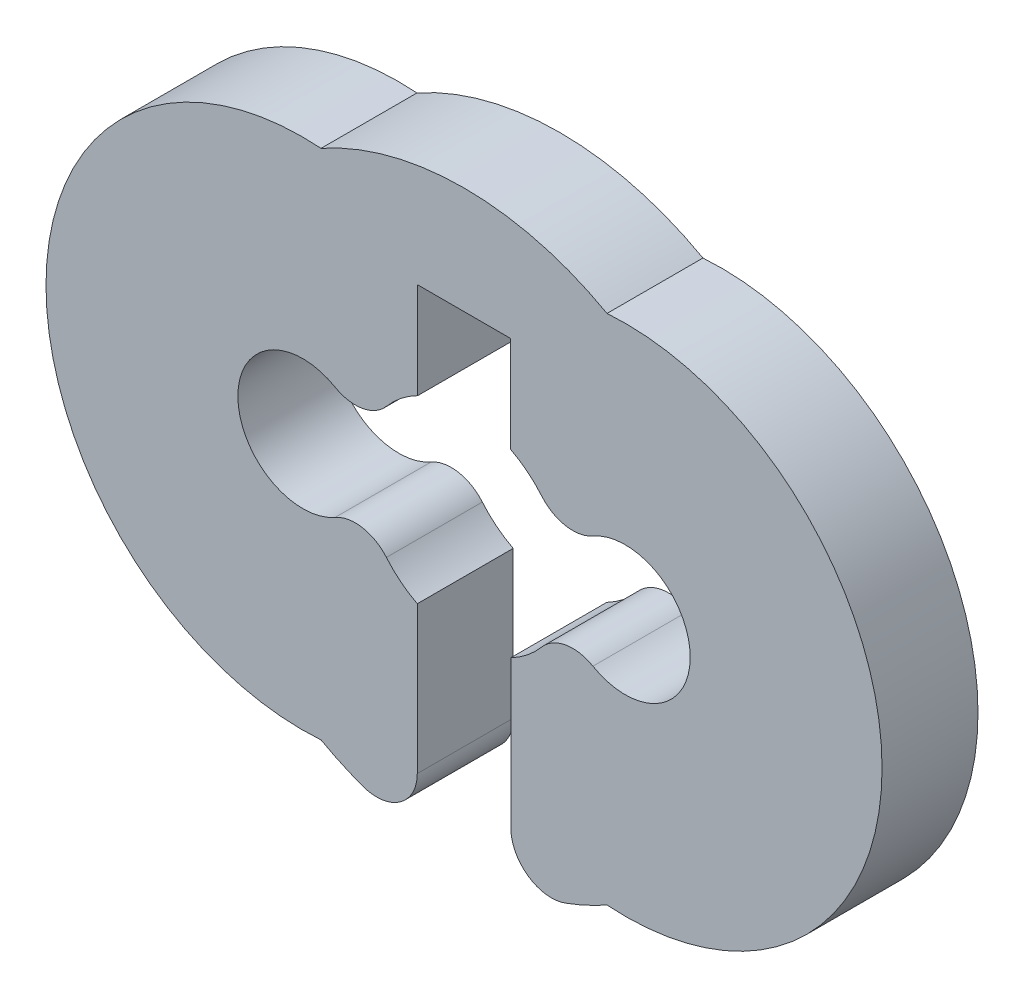
ISO-10303-21;
HEADER;
FILE_DESCRIPTION(('STEP AP214'),'2;1');
FILE_NAME('part.step','',(''),(''),'','','');
FILE_SCHEMA(('AUTOMOTIVE_DESIGN { 1 0 10303 214 1 1 1 1 }'));
ENDSEC;
DATA;
#1=APPLICATION_CONTEXT('core data for automotive mechanical design processes');
#2=APPLICATION_PROTOCOL_DEFINITION('international standard','automotive_design',2000,#1);
#3=PRODUCT_CONTEXT('',#1,'mechanical');
#4=PRODUCT('Part','Part','',(#3));
#5=PRODUCT_RELATED_PRODUCT_CATEGORY('part','',(#4));
#6=PRODUCT_DEFINITION_FORMATION('','',#4);
#7=PRODUCT_DEFINITION_CONTEXT('part definition',#1,'design');
#8=PRODUCT_DEFINITION('design','',#6,#7);
#9=PRODUCT_DEFINITION_SHAPE('','',#8);
#10=(LENGTH_UNIT() NAMED_UNIT(*) SI_UNIT(.MILLI.,.METRE.));
#11=(NAMED_UNIT(*) PLANE_ANGLE_UNIT() SI_UNIT($,.RADIAN.));
#12=(NAMED_UNIT(*) SI_UNIT($,.STERADIAN.) SOLID_ANGLE_UNIT());
#13=UNCERTAINTY_MEASURE_WITH_UNIT(LENGTH_MEASURE(1.E-05),#10,'distance_accuracy_value','');
#14=(GEOMETRIC_REPRESENTATION_CONTEXT(3) GLOBAL_UNCERTAINTY_ASSIGNED_CONTEXT((#13)) GLOBAL_UNIT_ASSIGNED_CONTEXT((#10,
#11,#12)) REPRESENTATION_CONTEXT('',''));
#15=CARTESIAN_POINT('',(0.,0.,0.));
#16=DIRECTION('',(0.,0.,1.));
#17=DIRECTION('',(1.,0.,0.));
#18=AXIS2_PLACEMENT_3D('',#15,#16,#17);
#19=CARTESIAN_POINT('',(0.,0.,3.));
#20=DIRECTION('',(0.,0.,-1.));
#21=DIRECTION('',(-1.,0.,0.));
#22=AXIS2_PLACEMENT_3D('',#19,#20,#21);
#23=CYLINDRICAL_SURFACE('',#22,3.17499999999999);
#24=CARTESIAN_POINT('',(0.,0.,0.));
#25=DIRECTION('',(0.,0.,-1.));
#26=DIRECTION('',(1.,0.,0.));
#27=AXIS2_PLACEMENT_3D('',#24,#25,#26);
#28=CIRCLE('',#27,3.17499999999999);
#29=CARTESIAN_POINT('',(1.4475,2.82583947704041,0.));
#30=VERTEX_POINT('',#29);
#31=CARTESIAN_POINT('',(2.42771989137687,2.04616742448243,0.));
#32=VERTEX_POINT('',#31);
#33=EDGE_CURVE('E264',#30,#32,#28,.T.);
#34=ORIENTED_EDGE('',*,*,#33,.T.);
#35=DIRECTION('',(0.,0.,-1.));
#36=VECTOR('',#35,1.);
#37=CARTESIAN_POINT('',(2.42771989137687,2.04616742448243,3.));
#38=LINE('',#37,#36);
#39=CARTESIAN_POINT('',(2.42771989137687,2.04616742448243,3.));
#40=VERTEX_POINT('',#39);
#41=EDGE_CURVE('E49',#32,#40,#38,.F.);
#42=ORIENTED_EDGE('',*,*,#41,.T.);
#43=CARTESIAN_POINT('',(0.,0.,3.));
#44=DIRECTION('',(0.,0.,-1.));
#45=DIRECTION('',(1.,0.,0.));
#46=AXIS2_PLACEMENT_3D('',#43,#44,#45);
#47=CIRCLE('',#46,3.17499999999999);
#48=CARTESIAN_POINT('',(1.4475,2.82583947704041,3.));
#49=VERTEX_POINT('',#48);
#50=EDGE_CURVE('E263',#49,#40,#47,.T.);
#51=ORIENTED_EDGE('',*,*,#50,.F.);
#52=DIRECTION('',(0.,0.,-1.));
#53=VECTOR('',#52,1.);
#54=CARTESIAN_POINT('',(1.4475,2.82583947704041,3.));
#55=LINE('',#54,#53);
#56=EDGE_CURVE('E334',#49,#30,#55,.T.);
#57=ORIENTED_EDGE('',*,*,#56,.T.);
#58=EDGE_LOOP('',(#34,#42,#51,#57));
#59=FACE_BOUND('',#58,.T.);
#60=ADVANCED_FACE('F45',(#59),#23,.F.);
#61=CARTESIAN_POINT('',(5.04108486083811,0.,3.));
#62=DIRECTION('',(0.,0.,-1.));
#63=DIRECTION('',(-1.,0.,0.));
#64=AXIS2_PLACEMENT_3D('',#61,#62,#63);
#65=CYLINDRICAL_SURFACE('',#64,2.032);
#66=CARTESIAN_POINT('',(5.04108486083811,0.,0.));
#67=DIRECTION('',(0.,0.,-1.));
#68=DIRECTION('',(-1.,0.,0.));
#69=AXIS2_PLACEMENT_3D('',#66,#67,#68);
#70=CIRCLE('',#69,2.032);
#71=CARTESIAN_POINT('',(4.03045285289318,1.76285193493872,0.));
#72=VERTEX_POINT('',#71);
#73=CARTESIAN_POINT('',(4.03045285289318,-1.76285193493872,0.));
#74=VERTEX_POINT('',#73);
#75=EDGE_CURVE('E305',#72,#74,#70,.T.);
#76=ORIENTED_EDGE('',*,*,#75,.T.);
#77=DIRECTION('',(0.,0.,-1.));
#78=VECTOR('',#77,1.);
#79=CARTESIAN_POINT('',(4.03045285289318,-1.76285193493872,3.));
#80=LINE('',#79,#78);
#81=CARTESIAN_POINT('',(4.03045285289318,-1.76285193493872,3.));
#82=VERTEX_POINT('',#81);
#83=EDGE_CURVE('E258',#74,#82,#80,.F.);
#84=ORIENTED_EDGE('',*,*,#83,.T.);
#85=CARTESIAN_POINT('',(5.04108486083811,0.,3.));
#86=DIRECTION('',(0.,0.,-1.));
#87=DIRECTION('',(-1.,0.,0.));
#88=AXIS2_PLACEMENT_3D('',#85,#86,#87);
#89=CIRCLE('',#88,2.032);
#90=CARTESIAN_POINT('',(4.03045285289318,1.76285193493872,3.));
#91=VERTEX_POINT('',#90);
#92=EDGE_CURVE('E204',#91,#82,#89,.T.);
#93=ORIENTED_EDGE('',*,*,#92,.F.);
#94=DIRECTION('',(0.,0.,-1.));
#95=VECTOR('',#94,1.);
#96=CARTESIAN_POINT('',(4.03045285289318,1.76285193493872,3.));
#97=LINE('',#96,#95);
#98=EDGE_CURVE('E251',#91,#72,#97,.T.);
#99=ORIENTED_EDGE('',*,*,#98,.T.);
#100=EDGE_LOOP('',(#76,#84,#93,#99));
#101=FACE_BOUND('',#100,.T.);
#102=ADVANCED_FACE('F450',(#101),#65,.F.);
#103=CARTESIAN_POINT('',(0.,0.,3.));
#104=DIRECTION('',(0.,0.,-1.));
#105=DIRECTION('',(-1.,0.,0.));
#106=AXIS2_PLACEMENT_3D('',#103,#104,#105);
#107=CYLINDRICAL_SURFACE('',#106,3.175);
#108=CARTESIAN_POINT('',(0.,0.,3.));
#109=DIRECTION('',(0.,0.,-1.));
#110=DIRECTION('',(-1.,0.,0.));
#111=AXIS2_PLACEMENT_3D('',#108,#109,#110);
#112=CIRCLE('',#111,3.175);
#113=CARTESIAN_POINT('',(2.42771989137686,-2.04616742448245,3.));
#114=VERTEX_POINT('',#113);
#115=CARTESIAN_POINT('',(1.4625,-2.8181055249937,3.));
#116=VERTEX_POINT('',#115);
#117=EDGE_CURVE('E195',#114,#116,#112,.T.);
#118=ORIENTED_EDGE('',*,*,#117,.F.);
#119=DIRECTION('',(0.,0.,-1.));
#120=VECTOR('',#119,1.);
#121=CARTESIAN_POINT('',(2.42771989137686,-2.04616742448245,3.));
#122=LINE('',#121,#120);
#123=CARTESIAN_POINT('',(2.42771989137686,-2.04616742448245,0.));
#124=VERTEX_POINT('',#123);
#125=EDGE_CURVE('E253',#114,#124,#122,.T.);
#126=ORIENTED_EDGE('',*,*,#125,.T.);
#127=CARTESIAN_POINT('',(0.,0.,0.));
#128=DIRECTION('',(0.,0.,-1.));
#129=DIRECTION('',(-1.,0.,0.));
#130=AXIS2_PLACEMENT_3D('',#127,#128,#129);
#131=CIRCLE('',#130,3.175);
#132=CARTESIAN_POINT('',(1.4625,-2.8181055249937,0.));
#133=VERTEX_POINT('',#132);
#134=EDGE_CURVE('E207',#124,#133,#131,.T.);
#135=ORIENTED_EDGE('',*,*,#134,.T.);
#136=DIRECTION('',(0.,0.,-1.));
#137=VECTOR('',#136,1.);
#138=CARTESIAN_POINT('',(1.4625,-2.8181055249937,3.));
#139=LINE('',#138,#137);
#140=EDGE_CURVE('E206',#116,#133,#139,.T.);
#141=ORIENTED_EDGE('',*,*,#140,.F.);
#142=EDGE_LOOP('',(#118,#126,#135,#141));
#143=FACE_BOUND('',#142,.T.);
#144=ADVANCED_FACE('F210',(#143),#107,.F.);
#145=CARTESIAN_POINT('',(1.4625,-9.05768837783681,3.));
#146=DIRECTION('',(1.,0.,0.));
#147=DIRECTION('',(0.,1.,0.));
#148=AXIS2_PLACEMENT_3D('',#145,#146,#147);
#149=PLANE('',#148);
#150=DIRECTION('',(0.,-1.,0.));
#151=VECTOR('',#150,1.);
#152=CARTESIAN_POINT('',(1.4625,-9.05768837783681,0.));
#153=LINE('',#152,#151);
#154=CARTESIAN_POINT('',(1.4625,-7.4177131752313,0.));
#155=VERTEX_POINT('',#154);
#156=EDGE_CURVE('E301',#133,#155,#153,.T.);
#157=ORIENTED_EDGE('',*,*,#156,.T.);
#158=DIRECTION('',(0.,0.,-1.));
#159=VECTOR('',#158,1.);
#160=CARTESIAN_POINT('',(1.4625,-7.4177131752313,3.));
#161=LINE('',#160,#159);
#162=CARTESIAN_POINT('',(1.4625,-7.4177131752313,3.));
#163=VERTEX_POINT('',#162);
#164=EDGE_CURVE('E217',#155,#163,#161,.F.);
#165=ORIENTED_EDGE('',*,*,#164,.T.);
#166=DIRECTION('',(0.,-1.,0.));
#167=VECTOR('',#166,1.);
#168=CARTESIAN_POINT('',(1.4625,-9.05768837783681,3.));
#169=LINE('',#168,#167);
#170=EDGE_CURVE('E198',#116,#163,#169,.T.);
#171=ORIENTED_EDGE('',*,*,#170,.F.);
#172=ORIENTED_EDGE('',*,*,#140,.T.);
#173=EDGE_LOOP('',(#157,#165,#171,#172));
#174=FACE_BOUND('',#173,.T.);
#175=ADVANCED_FACE('F216',(#174),#149,.F.);
#176=CARTESIAN_POINT('',(0.,0.,3.));
#177=DIRECTION('',(0.,0.,-1.));
#178=DIRECTION('',(-1.,0.,0.));
#179=AXIS2_PLACEMENT_3D('',#176,#177,#178);
#180=CYLINDRICAL_SURFACE('',#179,9.17500000000008);
#181=CARTESIAN_POINT('',(0.,0.,3.));
#182=DIRECTION('',(0.,0.,1.));
#183=DIRECTION('',(-1.,0.,0.));
#184=AXIS2_PLACEMENT_3D('',#181,#182,#183);
#185=CIRCLE('',#184,9.17500000000008);
#186=CARTESIAN_POINT('',(3.17149746995571,-8.60942674038548,3.));
#187=VERTEX_POINT('',#186);
#188=CARTESIAN_POINT('',(4.47127342810456,-8.01176253586726,3.));
#189=VERTEX_POINT('',#188);
#190=EDGE_CURVE('E218',#187,#189,#185,.T.);
#191=ORIENTED_EDGE('',*,*,#190,.F.);
#192=DIRECTION('',(0.,0.,-1.));
#193=VECTOR('',#192,1.);
#194=CARTESIAN_POINT('',(3.17149746995572,-8.60942674038548,3.));
#195=LINE('',#194,#193);
#196=CARTESIAN_POINT('',(3.17149746995571,-8.60942674038548,0.));
#197=VERTEX_POINT('',#196);
#198=EDGE_CURVE('E213',#187,#197,#195,.T.);
#199=ORIENTED_EDGE('',*,*,#198,.T.);
#200=CARTESIAN_POINT('',(0.,0.,0.));
#201=DIRECTION('',(0.,0.,1.));
#202=DIRECTION('',(-1.,0.,0.));
#203=AXIS2_PLACEMENT_3D('',#200,#201,#202);
#204=CIRCLE('',#203,9.17500000000008);
#205=CARTESIAN_POINT('',(4.47127342810456,-8.01176253586726,0.));
#206=VERTEX_POINT('',#205);
#207=EDGE_CURVE('E302',#197,#206,#204,.T.);
#208=ORIENTED_EDGE('',*,*,#207,.T.);
#209=DIRECTION('',(0.,0.,-1.));
#210=VECTOR('',#209,1.);
#211=CARTESIAN_POINT('',(4.47127342810456,-8.01176253586726,3.));
#212=LINE('',#211,#210);
#213=EDGE_CURVE('E212',#189,#206,#212,.T.);
#214=ORIENTED_EDGE('',*,*,#213,.F.);
#215=EDGE_LOOP('',(#191,#199,#208,#214));
#216=FACE_BOUND('',#215,.T.);
#217=ADVANCED_FACE('F380',(#216),#180,.T.);
#218=CARTESIAN_POINT('',(5.04108486083811,0.,3.));
#219=DIRECTION('',(0.,0.,-1.));
#220=DIRECTION('',(-1.,0.,0.));
#221=AXIS2_PLACEMENT_3D('',#218,#219,#220);
#222=CYLINDRICAL_SURFACE('',#221,8.032);
#223=CARTESIAN_POINT('',(5.04108486083811,0.,0.));
#224=DIRECTION('',(0.,0.,1.));
#225=DIRECTION('',(-1.,0.,0.));
#226=AXIS2_PLACEMENT_3D('',#223,#224,#225);
#227=CIRCLE('',#226,8.032);
#228=CARTESIAN_POINT('',(4.47127342810455,8.01176253586726,0.));
#229=VERTEX_POINT('',#228);
#230=EDGE_CURVE('E309',#206,#229,#227,.T.);
#231=ORIENTED_EDGE('',*,*,#230,.T.);
#232=DIRECTION('',(0.,0.,-1.));
#233=VECTOR('',#232,1.);
#234=CARTESIAN_POINT('',(4.47127342810455,8.01176253586726,3.));
#235=LINE('',#234,#233);
#236=CARTESIAN_POINT('',(4.47127342810455,8.01176253586726,3.));
#237=VERTEX_POINT('',#236);
#238=EDGE_CURVE('E352',#237,#229,#235,.T.);
#239=ORIENTED_EDGE('',*,*,#238,.F.);
#240=CARTESIAN_POINT('',(5.04108486083811,0.,3.));
#241=DIRECTION('',(0.,0.,1.));
#242=DIRECTION('',(-1.,0.,0.));
#243=AXIS2_PLACEMENT_3D('',#240,#241,#242);
#244=CIRCLE('',#243,8.032);
#245=EDGE_CURVE('E222',#189,#237,#244,.T.);
#246=ORIENTED_EDGE('',*,*,#245,.F.);
#247=ORIENTED_EDGE('',*,*,#213,.T.);
#248=EDGE_LOOP('',(#231,#239,#246,#247));
#249=FACE_BOUND('',#248,.T.);
#250=ADVANCED_FACE('F381',(#249),#222,.T.);
#251=CARTESIAN_POINT('',(0.,-1.05818132034585E-13,3.));
#252=DIRECTION('',(0.,0.,-1.));
#253=DIRECTION('',(-1.,0.,0.));
#254=AXIS2_PLACEMENT_3D('',#251,#252,#253);
#255=CYLINDRICAL_SURFACE('',#254,9.17500000000009);
#256=CARTESIAN_POINT('',(0.,-1.05818132034585E-13,0.));
#257=DIRECTION('',(0.,0.,1.));
#258=DIRECTION('',(-1.,0.,0.));
#259=AXIS2_PLACEMENT_3D('',#256,#257,#258);
#260=CIRCLE('',#259,9.17500000000009);
#261=CARTESIAN_POINT('',(-4.47127342810455,8.01176253586726,0.));
#262=VERTEX_POINT('',#261);
#263=EDGE_CURVE('E315',#229,#262,#260,.T.);
#264=ORIENTED_EDGE('',*,*,#263,.T.);
#265=DIRECTION('',(0.,0.,-1.));
#266=VECTOR('',#265,1.);
#267=CARTESIAN_POINT('',(-4.47127342810455,8.01176253586726,3.));
#268=LINE('',#267,#266);
#269=CARTESIAN_POINT('',(-4.47127342810455,8.01176253586726,3.));
#270=VERTEX_POINT('',#269);
#271=EDGE_CURVE('E348',#270,#262,#268,.T.);
#272=ORIENTED_EDGE('',*,*,#271,.F.);
#273=CARTESIAN_POINT('',(0.,-1.05818132034585E-13,3.));
#274=DIRECTION('',(0.,0.,1.));
#275=DIRECTION('',(-1.,0.,0.));
#276=AXIS2_PLACEMENT_3D('',#273,#274,#275);
#277=CIRCLE('',#276,9.17500000000009);
#278=EDGE_CURVE('E382',#237,#270,#277,.T.);
#279=ORIENTED_EDGE('',*,*,#278,.F.);
#280=ORIENTED_EDGE('',*,*,#238,.T.);
#281=EDGE_LOOP('',(#264,#272,#279,#280));
#282=FACE_BOUND('',#281,.T.);
#283=ADVANCED_FACE('F440',(#282),#255,.T.);
#284=CARTESIAN_POINT('',(-5.04108486083811,0.,3.));
#285=DIRECTION('',(0.,0.,-1.));
#286=DIRECTION('',(-1.,0.,0.));
#287=AXIS2_PLACEMENT_3D('',#284,#285,#286);
#288=CYLINDRICAL_SURFACE('',#287,8.032);
#289=CARTESIAN_POINT('',(-5.04108486083811,0.,0.));
#290=DIRECTION('',(0.,0.,1.));
#291=DIRECTION('',(1.,0.,0.));
#292=AXIS2_PLACEMENT_3D('',#289,#290,#291);
#293=CIRCLE('',#292,8.032);
#294=CARTESIAN_POINT('',(-4.47127342810455,-8.01176253586726,0.));
#295=VERTEX_POINT('',#294);
#296=EDGE_CURVE('E314',#262,#295,#293,.T.);
#297=ORIENTED_EDGE('',*,*,#296,.T.);
#298=DIRECTION('',(0.,0.,-1.));
#299=VECTOR('',#298,1.);
#300=CARTESIAN_POINT('',(-4.47127342810455,-8.01176253586726,3.));
#301=LINE('',#300,#299);
#302=CARTESIAN_POINT('',(-4.47127342810455,-8.01176253586726,3.));
#303=VERTEX_POINT('',#302);
#304=EDGE_CURVE('E350',#303,#295,#301,.T.);
#305=ORIENTED_EDGE('',*,*,#304,.F.);
#306=CARTESIAN_POINT('',(-5.04108486083811,0.,3.));
#307=DIRECTION('',(0.,0.,1.));
#308=DIRECTION('',(1.,0.,0.));
#309=AXIS2_PLACEMENT_3D('',#306,#307,#308);
#310=CIRCLE('',#309,8.032);
#311=EDGE_CURVE('E383',#270,#303,#310,.T.);
#312=ORIENTED_EDGE('',*,*,#311,.F.);
#313=ORIENTED_EDGE('',*,*,#271,.T.);
#314=EDGE_LOOP('',(#297,#305,#312,#313));
#315=FACE_BOUND('',#314,.T.);
#316=ADVANCED_FACE('F433',(#315),#288,.T.);
#317=CARTESIAN_POINT('',(0.,0.,3.));
#318=DIRECTION('',(0.,0.,-1.));
#319=DIRECTION('',(-1.,0.,0.));
#320=AXIS2_PLACEMENT_3D('',#317,#318,#319);
#321=CYLINDRICAL_SURFACE('',#320,9.1750000000001);
#322=CARTESIAN_POINT('',(0.,0.,0.));
#323=DIRECTION('',(0.,0.,1.));
#324=DIRECTION('',(1.,0.,0.));
#325=AXIS2_PLACEMENT_3D('',#322,#323,#324);
#326=CIRCLE('',#325,9.1750000000001);
#327=CARTESIAN_POINT('',(-3.17149746995572,-8.60942674038547,0.));
#328=VERTEX_POINT('',#327);
#329=EDGE_CURVE('E316',#295,#328,#326,.T.);
#330=ORIENTED_EDGE('',*,*,#329,.T.);
#331=DIRECTION('',(0.,0.,-1.));
#332=VECTOR('',#331,1.);
#333=CARTESIAN_POINT('',(-3.17149746995572,-8.60942674038547,3.));
#334=LINE('',#333,#332);
#335=CARTESIAN_POINT('',(-3.17149746995572,-8.60942674038547,3.));
#336=VERTEX_POINT('',#335);
#337=EDGE_CURVE('E242',#328,#336,#334,.F.);
#338=ORIENTED_EDGE('',*,*,#337,.T.);
#339=CARTESIAN_POINT('',(0.,0.,3.));
#340=DIRECTION('',(0.,0.,1.));
#341=DIRECTION('',(1.,0.,0.));
#342=AXIS2_PLACEMENT_3D('',#339,#340,#341);
#343=CIRCLE('',#342,9.1750000000001);
#344=EDGE_CURVE('E394',#303,#336,#343,.T.);
#345=ORIENTED_EDGE('',*,*,#344,.F.);
#346=ORIENTED_EDGE('',*,*,#304,.T.);
#347=EDGE_LOOP('',(#330,#338,#345,#346));
#348=FACE_BOUND('',#347,.T.);
#349=ADVANCED_FACE('F427',(#348),#321,.T.);
#350=CARTESIAN_POINT('',(-1.4625,-9.05768837783681,3.));
#351=DIRECTION('',(-1.,0.,0.));
#352=DIRECTION('',(0.,-1.,0.));
#353=AXIS2_PLACEMENT_3D('',#350,#351,#352);
#354=PLANE('',#353);
#355=DIRECTION('',(0.,1.,0.));
#356=VECTOR('',#355,1.);
#357=CARTESIAN_POINT('',(-1.4625,-9.05768837783681,3.));
#358=LINE('',#357,#356);
#359=CARTESIAN_POINT('',(-1.4625,-7.4177131752313,3.));
#360=VERTEX_POINT('',#359);
#361=CARTESIAN_POINT('',(-1.4625,-2.8181055249937,3.));
#362=VERTEX_POINT('',#361);
#363=EDGE_CURVE('E397',#360,#362,#358,.T.);
#364=ORIENTED_EDGE('',*,*,#363,.F.);
#365=DIRECTION('',(0.,0.,-1.));
#366=VECTOR('',#365,1.);
#367=CARTESIAN_POINT('',(-1.4625,-7.4177131752313,3.));
#368=LINE('',#367,#366);
#369=CARTESIAN_POINT('',(-1.4625,-7.4177131752313,0.));
#370=VERTEX_POINT('',#369);
#371=EDGE_CURVE('E240',#360,#370,#368,.T.);
#372=ORIENTED_EDGE('',*,*,#371,.T.);
#373=DIRECTION('',(0.,1.,0.));
#374=VECTOR('',#373,1.);
#375=CARTESIAN_POINT('',(-1.4625,-9.05768837783681,0.));
#376=LINE('',#375,#374);
#377=CARTESIAN_POINT('',(-1.4625,-2.8181055249937,0.));
#378=VERTEX_POINT('',#377);
#379=EDGE_CURVE('E317',#370,#378,#376,.T.);
#380=ORIENTED_EDGE('',*,*,#379,.T.);
#381=DIRECTION('',(0.,0.,-1.));
#382=VECTOR('',#381,1.);
#383=CARTESIAN_POINT('',(-1.4625,-2.8181055249937,3.));
#384=LINE('',#383,#382);
#385=EDGE_CURVE('E342',#362,#378,#384,.T.);
#386=ORIENTED_EDGE('',*,*,#385,.F.);
#387=EDGE_LOOP('',(#364,#372,#380,#386));
#388=FACE_BOUND('',#387,.T.);
#389=ADVANCED_FACE('F423',(#388),#354,.F.);
#390=CARTESIAN_POINT('',(0.,0.,3.));
#391=DIRECTION('',(0.,0.,-1.));
#392=DIRECTION('',(-1.,0.,0.));
#393=AXIS2_PLACEMENT_3D('',#390,#391,#392);
#394=CYLINDRICAL_SURFACE('',#393,3.175);
#395=CARTESIAN_POINT('',(0.,0.,0.));
#396=DIRECTION('',(0.,0.,-1.));
#397=DIRECTION('',(1.,0.,0.));
#398=AXIS2_PLACEMENT_3D('',#395,#396,#397);
#399=CIRCLE('',#398,3.175);
#400=CARTESIAN_POINT('',(-2.42771989137686,-2.04616742448245,0.));
#401=VERTEX_POINT('',#400);
#402=EDGE_CURVE('E321',#378,#401,#399,.T.);
#403=ORIENTED_EDGE('',*,*,#402,.T.);
#404=DIRECTION('',(0.,0.,-1.));
#405=VECTOR('',#404,1.);
#406=CARTESIAN_POINT('',(-2.42771989137686,-2.04616742448245,3.));
#407=LINE('',#406,#405);
#408=CARTESIAN_POINT('',(-2.42771989137686,-2.04616742448245,3.));
#409=VERTEX_POINT('',#408);
#410=EDGE_CURVE('E247',#401,#409,#407,.F.);
#411=ORIENTED_EDGE('',*,*,#410,.T.);
#412=CARTESIAN_POINT('',(0.,0.,3.));
#413=DIRECTION('',(0.,0.,-1.));
#414=DIRECTION('',(1.,0.,0.));
#415=AXIS2_PLACEMENT_3D('',#412,#413,#414);
#416=CIRCLE('',#415,3.175);
#417=EDGE_CURVE('E405',#362,#409,#416,.T.);
#418=ORIENTED_EDGE('',*,*,#417,.F.);
#419=ORIENTED_EDGE('',*,*,#385,.T.);
#420=EDGE_LOOP('',(#403,#411,#418,#419));
#421=FACE_BOUND('',#420,.T.);
#422=ADVANCED_FACE('F507',(#421),#394,.F.);
#423=CARTESIAN_POINT('',(-5.04108486083811,0.,3.));
#424=DIRECTION('',(0.,0.,-1.));
#425=DIRECTION('',(-1.,0.,0.));
#426=AXIS2_PLACEMENT_3D('',#423,#424,#425);
#427=CYLINDRICAL_SURFACE('',#426,2.032);
#428=CARTESIAN_POINT('',(-5.04108486083811,0.,3.));
#429=DIRECTION('',(0.,0.,-1.));
#430=DIRECTION('',(1.,0.,0.));
#431=AXIS2_PLACEMENT_3D('',#428,#429,#430);
#432=CIRCLE('',#431,2.032);
#433=CARTESIAN_POINT('',(-4.03045285289318,-1.76285193493872,3.));
#434=VERTEX_POINT('',#433);
#435=CARTESIAN_POINT('',(-4.03045285289318,1.76285193493872,3.));
#436=VERTEX_POINT('',#435);
#437=EDGE_CURVE('E502',#434,#436,#432,.T.);
#438=ORIENTED_EDGE('',*,*,#437,.F.);
#439=DIRECTION('',(0.,0.,-1.));
#440=VECTOR('',#439,1.);
#441=CARTESIAN_POINT('',(-4.03045285289318,-1.76285193493872,3.));
#442=LINE('',#441,#440);
#443=CARTESIAN_POINT('',(-4.03045285289318,-1.76285193493872,0.));
#444=VERTEX_POINT('',#443);
#445=EDGE_CURVE('E246',#434,#444,#442,.T.);
#446=ORIENTED_EDGE('',*,*,#445,.T.);
#447=CARTESIAN_POINT('',(-5.04108486083811,0.,0.));
#448=DIRECTION('',(0.,0.,-1.));
#449=DIRECTION('',(1.,0.,0.));
#450=AXIS2_PLACEMENT_3D('',#447,#448,#449);
#451=CIRCLE('',#450,2.032);
#452=CARTESIAN_POINT('',(-4.03045285289318,1.76285193493872,0.));
#453=VERTEX_POINT('',#452);
#454=EDGE_CURVE('E322',#444,#453,#451,.T.);
#455=ORIENTED_EDGE('',*,*,#454,.T.);
#456=DIRECTION('',(0.,0.,-1.));
#457=VECTOR('',#456,1.);
#458=CARTESIAN_POINT('',(-4.03045285289318,1.76285193493872,3.));
#459=LINE('',#458,#457);
#460=EDGE_CURVE('E64',#453,#436,#459,.F.);
#461=ORIENTED_EDGE('',*,*,#460,.T.);
#462=EDGE_LOOP('',(#438,#446,#455,#461));
#463=FACE_BOUND('',#462,.T.);
#464=ADVANCED_FACE('F508',(#463),#427,.F.);
#465=CARTESIAN_POINT('',(0.,0.,3.));
#466=DIRECTION('',(0.,0.,-1.));
#467=DIRECTION('',(-1.,0.,0.));
#468=AXIS2_PLACEMENT_3D('',#465,#466,#467);
#469=CYLINDRICAL_SURFACE('',#468,3.17500000000008);
#470=CARTESIAN_POINT('',(0.,0.,3.));
#471=DIRECTION('',(0.,0.,-1.));
#472=DIRECTION('',(-1.,0.,0.));
#473=AXIS2_PLACEMENT_3D('',#470,#471,#472);
#474=CIRCLE('',#473,3.17500000000008);
#475=CARTESIAN_POINT('',(-2.42771989137685,2.04616742448244,3.));
#476=VERTEX_POINT('',#475);
#477=CARTESIAN_POINT('',(-1.4475,2.82583947704041,3.));
#478=VERTEX_POINT('',#477);
#479=EDGE_CURVE('E480',#476,#478,#474,.T.);
#480=ORIENTED_EDGE('',*,*,#479,.F.);
#481=DIRECTION('',(0.,0.,-1.));
#482=VECTOR('',#481,1.);
#483=CARTESIAN_POINT('',(-2.42771989137685,2.04616742448244,3.));
#484=LINE('',#483,#482);
#485=CARTESIAN_POINT('',(-2.42771989137685,2.04616742448244,0.));
#486=VERTEX_POINT('',#485);
#487=EDGE_CURVE('E12',#476,#486,#484,.T.);
#488=ORIENTED_EDGE('',*,*,#487,.T.);
#489=CARTESIAN_POINT('',(0.,0.,0.));
#490=DIRECTION('',(0.,0.,-1.));
#491=DIRECTION('',(-1.,0.,0.));
#492=AXIS2_PLACEMENT_3D('',#489,#490,#491);
#493=CIRCLE('',#492,3.17500000000008);
#494=CARTESIAN_POINT('',(-1.4475,2.82583947704041,0.));
#495=VERTEX_POINT('',#494);
#496=EDGE_CURVE('E326',#486,#495,#493,.T.);
#497=ORIENTED_EDGE('',*,*,#496,.T.);
#498=DIRECTION('',(0.,0.,-1.));
#499=VECTOR('',#498,1.);
#500=CARTESIAN_POINT('',(-1.4475,2.82583947704041,3.));
#501=LINE('',#500,#499);
#502=EDGE_CURVE('E341',#478,#495,#501,.T.);
#503=ORIENTED_EDGE('',*,*,#502,.F.);
#504=EDGE_LOOP('',(#480,#488,#497,#503));
#505=FACE_BOUND('',#504,.T.);
#506=ADVANCED_FACE('F474',(#505),#469,.F.);
#507=CARTESIAN_POINT('',(-1.4475,5.8258394770404,3.));
#508=DIRECTION('',(-1.,0.,0.));
#509=DIRECTION('',(0.,-1.,0.));
#510=AXIS2_PLACEMENT_3D('',#507,#508,#509);
#511=PLANE('',#510);
#512=DIRECTION('',(0.,1.,0.));
#513=VECTOR('',#512,1.);
#514=CARTESIAN_POINT('',(-1.4475,5.8258394770404,0.));
#515=LINE('',#514,#513);
#516=CARTESIAN_POINT('',(-1.4475,5.8258394770404,0.));
#517=VERTEX_POINT('',#516);
#518=EDGE_CURVE('E327',#495,#517,#515,.T.);
#519=ORIENTED_EDGE('',*,*,#518,.T.);
#520=DIRECTION('',(0.,0.,-1.));
#521=VECTOR('',#520,1.);
#522=CARTESIAN_POINT('',(-1.4475,5.8258394770404,3.));
#523=LINE('',#522,#521);
#524=CARTESIAN_POINT('',(-1.4475,5.8258394770404,3.));
#525=VERTEX_POINT('',#524);
#526=EDGE_CURVE('E337',#525,#517,#523,.T.);
#527=ORIENTED_EDGE('',*,*,#526,.F.);
#528=DIRECTION('',(0.,1.,0.));
#529=VECTOR('',#528,1.);
#530=CARTESIAN_POINT('',(-1.4475,5.8258394770404,3.));
#531=LINE('',#530,#529);
#532=EDGE_CURVE('E491',#478,#525,#531,.T.);
#533=ORIENTED_EDGE('',*,*,#532,.F.);
#534=ORIENTED_EDGE('',*,*,#502,.T.);
#535=EDGE_LOOP('',(#519,#527,#533,#534));
#536=FACE_BOUND('',#535,.T.);
#537=ADVANCED_FACE('F482',(#536),#511,.F.);
#538=CARTESIAN_POINT('',(-1.4475,5.8258394770404,3.));
#539=DIRECTION('',(0.,1.,0.));
#540=DIRECTION('',(-1.,0.,0.));
#541=AXIS2_PLACEMENT_3D('',#538,#539,#540);
#542=PLANE('',#541);
#543=DIRECTION('',(1.,0.,0.));
#544=VECTOR('',#543,1.);
#545=CARTESIAN_POINT('',(-1.4475,5.8258394770404,0.));
#546=LINE('',#545,#544);
#547=CARTESIAN_POINT('',(1.4475,5.82583947704041,0.));
#548=VERTEX_POINT('',#547);
#549=EDGE_CURVE('E329',#517,#548,#546,.T.);
#550=ORIENTED_EDGE('',*,*,#549,.T.);
#551=DIRECTION('',(0.,0.,-1.));
#552=VECTOR('',#551,1.);
#553=CARTESIAN_POINT('',(1.4475,5.82583947704041,3.));
#554=LINE('',#553,#552);
#555=CARTESIAN_POINT('',(1.4475,5.82583947704041,3.));
#556=VERTEX_POINT('',#555);
#557=EDGE_CURVE('E333',#556,#548,#554,.T.);
#558=ORIENTED_EDGE('',*,*,#557,.F.);
#559=DIRECTION('',(1.,0.,0.));
#560=VECTOR('',#559,1.);
#561=CARTESIAN_POINT('',(-1.4475,5.8258394770404,3.));
#562=LINE('',#561,#560);
#563=EDGE_CURVE('E489',#525,#556,#562,.T.);
#564=ORIENTED_EDGE('',*,*,#563,.F.);
#565=ORIENTED_EDGE('',*,*,#526,.T.);
#566=EDGE_LOOP('',(#550,#558,#564,#565));
#567=FACE_BOUND('',#566,.T.);
#568=ADVANCED_FACE('F488',(#567),#542,.F.);
#569=CARTESIAN_POINT('',(1.4475,5.82583947704041,3.));
#570=DIRECTION('',(1.,0.,0.));
#571=DIRECTION('',(0.,1.,0.));
#572=AXIS2_PLACEMENT_3D('',#569,#570,#571);
#573=PLANE('',#572);
#574=DIRECTION('',(0.,-1.,0.));
#575=VECTOR('',#574,1.);
#576=CARTESIAN_POINT('',(1.4475,5.82583947704041,0.));
#577=LINE('',#576,#575);
#578=EDGE_CURVE('E272',#548,#30,#577,.T.);
#579=ORIENTED_EDGE('',*,*,#578,.T.);
#580=ORIENTED_EDGE('',*,*,#56,.F.);
#581=DIRECTION('',(0.,-1.,0.));
#582=VECTOR('',#581,1.);
#583=CARTESIAN_POINT('',(1.4475,5.82583947704041,3.));
#584=LINE('',#583,#582);
#585=EDGE_CURVE('E271',#556,#49,#584,.T.);
#586=ORIENTED_EDGE('',*,*,#585,.F.);
#587=ORIENTED_EDGE('',*,*,#557,.T.);
#588=EDGE_LOOP('',(#579,#580,#586,#587));
#589=FACE_BOUND('',#588,.T.);
#590=ADVANCED_FACE('F569',(#589),#573,.F.);
#591=CARTESIAN_POINT('',(0.,0.,3.));
#592=DIRECTION('',(0.,0.,1.));
#593=DIRECTION('',(1.,0.,0.));
#594=AXIS2_PLACEMENT_3D('',#591,#592,#593);
#595=PLANE('',#594);
#596=ORIENTED_EDGE('',*,*,#170,.T.);
#597=CARTESIAN_POINT('',(2.7325,-7.4177131752313,3.));
#598=DIRECTION('',(0.,0.,1.));
#599=DIRECTION('',(1.,0.,0.));
#600=AXIS2_PLACEMENT_3D('',#597,#598,#599);
#601=CIRCLE('',#600,1.27);
#602=EDGE_CURVE('E233',#163,#187,#601,.T.);
#603=ORIENTED_EDGE('',*,*,#602,.T.);
#604=ORIENTED_EDGE('',*,*,#190,.T.);
#605=ORIENTED_EDGE('',*,*,#245,.T.);
#606=ORIENTED_EDGE('',*,*,#278,.T.);
#607=ORIENTED_EDGE('',*,*,#311,.T.);
#608=ORIENTED_EDGE('',*,*,#344,.T.);
#609=CARTESIAN_POINT('',(-2.7325,-7.4177131752313,3.));
#610=DIRECTION('',(0.,0.,1.));
#611=DIRECTION('',(1.,0.,0.));
#612=AXIS2_PLACEMENT_3D('',#609,#610,#611);
#613=CIRCLE('',#612,1.27);
#614=EDGE_CURVE('E236',#336,#360,#613,.T.);
#615=ORIENTED_EDGE('',*,*,#614,.T.);
#616=ORIENTED_EDGE('',*,*,#363,.T.);
#617=ORIENTED_EDGE('',*,*,#417,.T.);
#618=CARTESIAN_POINT('',(-3.3988078479276,-2.86463439427543,3.));
#619=DIRECTION('',(0.,0.,1.));
#620=DIRECTION('',(1.,0.,0.));
#621=AXIS2_PLACEMENT_3D('',#618,#619,#620);
#622=CIRCLE('',#621,1.27);
#623=EDGE_CURVE('E279',#409,#434,#622,.T.);
#624=ORIENTED_EDGE('',*,*,#623,.T.);
#625=ORIENTED_EDGE('',*,*,#437,.T.);
#626=CARTESIAN_POINT('',(-3.39880784792759,2.86463439427542,3.));
#627=DIRECTION('',(0.,0.,1.));
#628=DIRECTION('',(1.,0.,0.));
#629=AXIS2_PLACEMENT_3D('',#626,#627,#628);
#630=CIRCLE('',#629,1.27);
#631=EDGE_CURVE('E60',#436,#476,#630,.T.);
#632=ORIENTED_EDGE('',*,*,#631,.T.);
#633=ORIENTED_EDGE('',*,*,#479,.T.);
#634=ORIENTED_EDGE('',*,*,#532,.T.);
#635=ORIENTED_EDGE('',*,*,#563,.T.);
#636=ORIENTED_EDGE('',*,*,#585,.T.);
#637=ORIENTED_EDGE('',*,*,#50,.T.);
#638=CARTESIAN_POINT('',(3.3988078479276,2.86463439427543,3.));
#639=DIRECTION('',(0.,0.,1.));
#640=DIRECTION('',(1.,0.,0.));
#641=AXIS2_PLACEMENT_3D('',#638,#639,#640);
#642=CIRCLE('',#641,1.27);
#643=EDGE_CURVE('E268',#40,#91,#642,.T.);
#644=ORIENTED_EDGE('',*,*,#643,.T.);
#645=ORIENTED_EDGE('',*,*,#92,.T.);
#646=CARTESIAN_POINT('',(3.3988078479276,-2.86463439427543,3.));
#647=DIRECTION('',(0.,0.,1.));
#648=DIRECTION('',(1.,0.,0.));
#649=AXIS2_PLACEMENT_3D('',#646,#647,#648);
#650=CIRCLE('',#649,1.27);
#651=EDGE_CURVE('E199',#82,#114,#650,.T.);
#652=ORIENTED_EDGE('',*,*,#651,.T.);
#653=ORIENTED_EDGE('',*,*,#117,.T.);
#654=EDGE_LOOP('',(#596,#603,#604,#605,#606,#607,#608,#615,#616,#617,#624,#625,#632,#633,#634,
#635,#636,#637,#644,#645,#652,#653));
#655=FACE_BOUND('',#654,.T.);
#656=ADVANCED_FACE('F192',(#655),#595,.T.);
#657=CARTESIAN_POINT('',(0.,0.,0.));
#658=DIRECTION('',(0.,0.,1.));
#659=DIRECTION('',(1.,0.,0.));
#660=AXIS2_PLACEMENT_3D('',#657,#658,#659);
#661=PLANE('',#660);
#662=ORIENTED_EDGE('',*,*,#207,.F.);
#663=CARTESIAN_POINT('',(2.7325,-7.4177131752313,0.));
#664=DIRECTION('',(0.,0.,1.));
#665=DIRECTION('',(1.,0.,0.));
#666=AXIS2_PLACEMENT_3D('',#663,#664,#665);
#667=CIRCLE('',#666,1.27);
#668=EDGE_CURVE('E369',#197,#155,#667,.F.);
#669=ORIENTED_EDGE('',*,*,#668,.T.);
#670=ORIENTED_EDGE('',*,*,#156,.F.);
#671=ORIENTED_EDGE('',*,*,#134,.F.);
#672=CARTESIAN_POINT('',(3.3988078479276,-2.86463439427543,0.));
#673=DIRECTION('',(0.,0.,1.));
#674=DIRECTION('',(1.,0.,0.));
#675=AXIS2_PLACEMENT_3D('',#672,#673,#674);
#676=CIRCLE('',#675,1.27);
#677=EDGE_CURVE('E293',#124,#74,#676,.F.);
#678=ORIENTED_EDGE('',*,*,#677,.T.);
#679=ORIENTED_EDGE('',*,*,#75,.F.);
#680=CARTESIAN_POINT('',(3.3988078479276,2.86463439427543,0.));
#681=DIRECTION('',(0.,0.,1.));
#682=DIRECTION('',(1.,0.,0.));
#683=AXIS2_PLACEMENT_3D('',#680,#681,#682);
#684=CIRCLE('',#683,1.27);
#685=EDGE_CURVE('E362',#72,#32,#684,.F.);
#686=ORIENTED_EDGE('',*,*,#685,.T.);
#687=ORIENTED_EDGE('',*,*,#33,.F.);
#688=ORIENTED_EDGE('',*,*,#578,.F.);
#689=ORIENTED_EDGE('',*,*,#549,.F.);
#690=ORIENTED_EDGE('',*,*,#518,.F.);
#691=ORIENTED_EDGE('',*,*,#496,.F.);
#692=CARTESIAN_POINT('',(-3.39880784792759,2.86463439427542,0.));
#693=DIRECTION('',(0.,0.,1.));
#694=DIRECTION('',(1.,0.,0.));
#695=AXIS2_PLACEMENT_3D('',#692,#693,#694);
#696=CIRCLE('',#695,1.27);
#697=EDGE_CURVE('E359',#486,#453,#696,.F.);
#698=ORIENTED_EDGE('',*,*,#697,.T.);
#699=ORIENTED_EDGE('',*,*,#454,.F.);
#700=CARTESIAN_POINT('',(-3.3988078479276,-2.86463439427543,0.));
#701=DIRECTION('',(0.,0.,1.));
#702=DIRECTION('',(1.,0.,0.));
#703=AXIS2_PLACEMENT_3D('',#700,#701,#702);
#704=CIRCLE('',#703,1.27);
#705=EDGE_CURVE('E364',#444,#401,#704,.F.);
#706=ORIENTED_EDGE('',*,*,#705,.T.);
#707=ORIENTED_EDGE('',*,*,#402,.F.);
#708=ORIENTED_EDGE('',*,*,#379,.F.);
#709=CARTESIAN_POINT('',(-2.7325,-7.4177131752313,0.));
#710=DIRECTION('',(0.,0.,1.));
#711=DIRECTION('',(1.,0.,0.));
#712=AXIS2_PLACEMENT_3D('',#709,#710,#711);
#713=CIRCLE('',#712,1.27);
#714=EDGE_CURVE('E370',#370,#328,#713,.F.);
#715=ORIENTED_EDGE('',*,*,#714,.T.);
#716=ORIENTED_EDGE('',*,*,#329,.F.);
#717=ORIENTED_EDGE('',*,*,#296,.F.);
#718=ORIENTED_EDGE('',*,*,#263,.F.);
#719=ORIENTED_EDGE('',*,*,#230,.F.);
#720=EDGE_LOOP('',(#662,#669,#670,#671,#678,#679,#686,#687,#688,#689,#690,#691,#698,#699,#706,
#707,#708,#715,#716,#717,#718,#719));
#721=FACE_BOUND('',#720,.T.);
#722=ADVANCED_FACE('F297',(#721),#661,.F.);
#723=CARTESIAN_POINT('',(2.7325,-7.4177131752313,3.));
#724=DIRECTION('',(0.,0.,-1.));
#725=DIRECTION('',(-1.,0.,0.));
#726=AXIS2_PLACEMENT_3D('',#723,#724,#725);
#727=CYLINDRICAL_SURFACE('',#726,1.27);
#728=ORIENTED_EDGE('',*,*,#602,.F.);
#729=ORIENTED_EDGE('',*,*,#164,.F.);
#730=ORIENTED_EDGE('',*,*,#668,.F.);
#731=ORIENTED_EDGE('',*,*,#198,.F.);
#732=EDGE_LOOP('',(#728,#729,#730,#731));
#733=FACE_BOUND('',#732,.T.);
#734=ADVANCED_FACE('F373',(#733),#727,.T.);
#735=CARTESIAN_POINT('',(-2.7325,-7.4177131752313,3.));
#736=DIRECTION('',(0.,0.,-1.));
#737=DIRECTION('',(-1.,0.,0.));
#738=AXIS2_PLACEMENT_3D('',#735,#736,#737);
#739=CYLINDRICAL_SURFACE('',#738,1.27);
#740=ORIENTED_EDGE('',*,*,#614,.F.);
#741=ORIENTED_EDGE('',*,*,#337,.F.);
#742=ORIENTED_EDGE('',*,*,#714,.F.);
#743=ORIENTED_EDGE('',*,*,#371,.F.);
#744=EDGE_LOOP('',(#740,#741,#742,#743));
#745=FACE_BOUND('',#744,.T.);
#746=ADVANCED_FACE('F424',(#745),#739,.T.);
#747=CARTESIAN_POINT('',(-3.3988078479276,-2.86463439427543,3.));
#748=DIRECTION('',(0.,0.,-1.));
#749=DIRECTION('',(-1.,0.,0.));
#750=AXIS2_PLACEMENT_3D('',#747,#748,#749);
#751=CYLINDRICAL_SURFACE('',#750,1.27);
#752=ORIENTED_EDGE('',*,*,#623,.F.);
#753=ORIENTED_EDGE('',*,*,#410,.F.);
#754=ORIENTED_EDGE('',*,*,#705,.F.);
#755=ORIENTED_EDGE('',*,*,#445,.F.);
#756=EDGE_LOOP('',(#752,#753,#754,#755));
#757=FACE_BOUND('',#756,.T.);
#758=ADVANCED_FACE('F458',(#757),#751,.T.);
#759=CARTESIAN_POINT('',(3.3988078479276,-2.86463439427543,3.));
#760=DIRECTION('',(0.,0.,-1.));
#761=DIRECTION('',(-1.,0.,0.));
#762=AXIS2_PLACEMENT_3D('',#759,#760,#761);
#763=CYLINDRICAL_SURFACE('',#762,1.27);
#764=ORIENTED_EDGE('',*,*,#651,.F.);
#765=ORIENTED_EDGE('',*,*,#83,.F.);
#766=ORIENTED_EDGE('',*,*,#677,.F.);
#767=ORIENTED_EDGE('',*,*,#125,.F.);
#768=EDGE_LOOP('',(#764,#765,#766,#767));
#769=FACE_BOUND('',#768,.T.);
#770=ADVANCED_FACE('F294',(#769),#763,.T.);
#771=CARTESIAN_POINT('',(3.3988078479276,2.86463439427543,3.));
#772=DIRECTION('',(0.,0.,-1.));
#773=DIRECTION('',(-1.,0.,0.));
#774=AXIS2_PLACEMENT_3D('',#771,#772,#773);
#775=CYLINDRICAL_SURFACE('',#774,1.27);
#776=ORIENTED_EDGE('',*,*,#643,.F.);
#777=ORIENTED_EDGE('',*,*,#41,.F.);
#778=ORIENTED_EDGE('',*,*,#685,.F.);
#779=ORIENTED_EDGE('',*,*,#98,.F.);
#780=EDGE_LOOP('',(#776,#777,#778,#779));
#781=FACE_BOUND('',#780,.T.);
#782=ADVANCED_FACE('F277',(#781),#775,.T.);
#783=CARTESIAN_POINT('',(-3.39880784792759,2.86463439427542,3.));
#784=DIRECTION('',(0.,0.,-1.));
#785=DIRECTION('',(-1.,0.,0.));
#786=AXIS2_PLACEMENT_3D('',#783,#784,#785);
#787=CYLINDRICAL_SURFACE('',#786,1.27);
#788=ORIENTED_EDGE('',*,*,#631,.F.);
#789=ORIENTED_EDGE('',*,*,#460,.F.);
#790=ORIENTED_EDGE('',*,*,#697,.F.);
#791=ORIENTED_EDGE('',*,*,#487,.F.);
#792=EDGE_LOOP('',(#788,#789,#790,#791));
#793=FACE_BOUND('',#792,.T.);
#794=ADVANCED_FACE('F42',(#793),#787,.T.);
#795=CLOSED_SHELL('',(#60,#102,#144,#175,#217,#250,#283,#316,#349,#389,#422,#464,#506,#537,#568,
#590,#656,#722,#734,#746,#758,#770,#782,#794));
#796=MANIFOLD_SOLID_BREP('B2',#795);
#797=ADVANCED_BREP_SHAPE_REPRESENTATION('',(#18,#796),#14);
#798=SHAPE_DEFINITION_REPRESENTATION(#9,#797);
ENDSEC;
END-ISO-10303-21;
